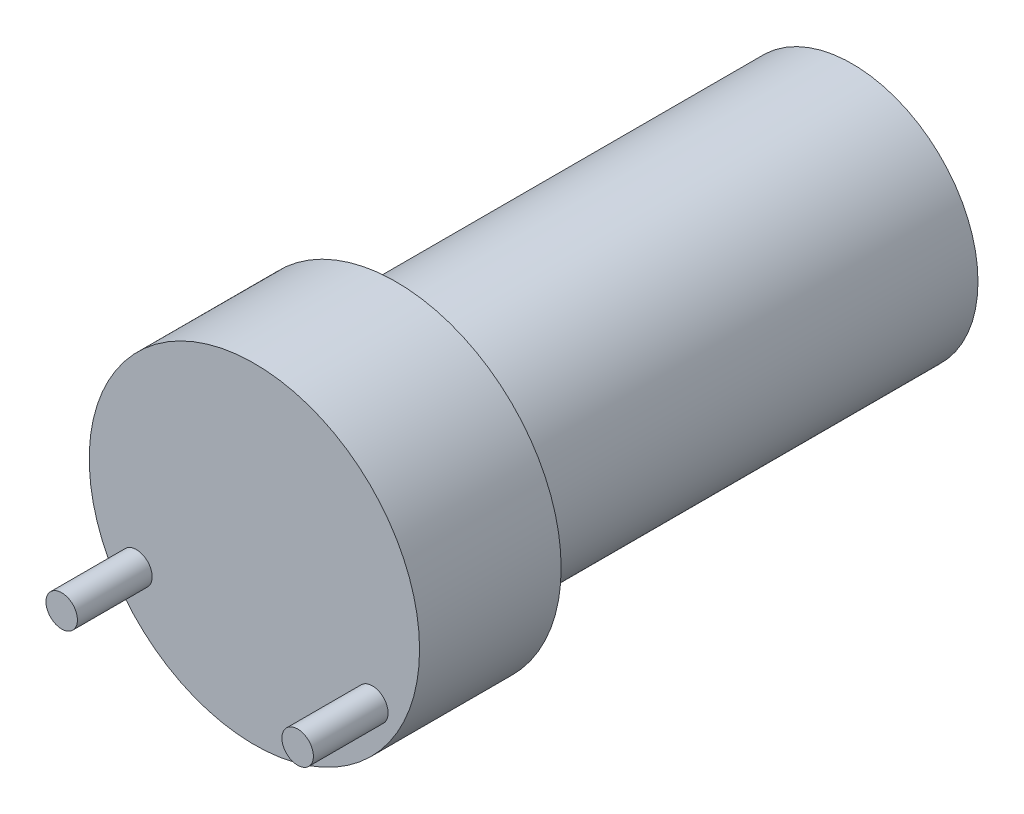
ISO-10303-21;
HEADER;
FILE_DESCRIPTION(('STEP AP214'),'2;1');
FILE_NAME('part.step','',(''),(''),'','','');
FILE_SCHEMA(('AUTOMOTIVE_DESIGN { 1 0 10303 214 1 1 1 1 }'));
ENDSEC;
DATA;
#1=APPLICATION_CONTEXT('core data for automotive mechanical design processes');
#2=APPLICATION_PROTOCOL_DEFINITION('international standard','automotive_design',2000,#1);
#3=PRODUCT_CONTEXT('',#1,'mechanical');
#4=PRODUCT('Part','Part','',(#3));
#5=PRODUCT_RELATED_PRODUCT_CATEGORY('part','',(#4));
#6=PRODUCT_DEFINITION_FORMATION('','',#4);
#7=PRODUCT_DEFINITION_CONTEXT('part definition',#1,'design');
#8=PRODUCT_DEFINITION('design','',#6,#7);
#9=PRODUCT_DEFINITION_SHAPE('','',#8);
#10=(LENGTH_UNIT() NAMED_UNIT(*) SI_UNIT(.MILLI.,.METRE.));
#11=(NAMED_UNIT(*) PLANE_ANGLE_UNIT() SI_UNIT($,.RADIAN.));
#12=(NAMED_UNIT(*) SI_UNIT($,.STERADIAN.) SOLID_ANGLE_UNIT());
#13=UNCERTAINTY_MEASURE_WITH_UNIT(LENGTH_MEASURE(1.E-05),#10,'distance_accuracy_value','');
#14=(GEOMETRIC_REPRESENTATION_CONTEXT(3) GLOBAL_UNCERTAINTY_ASSIGNED_CONTEXT((#13)) GLOBAL_UNIT_ASSIGNED_CONTEXT((#10,
#11,#12)) REPRESENTATION_CONTEXT('',''));
#15=CARTESIAN_POINT('',(0.,0.,0.));
#16=DIRECTION('',(0.,0.,1.));
#17=DIRECTION('',(1.,0.,0.));
#18=AXIS2_PLACEMENT_3D('',#15,#16,#17);
#19=CARTESIAN_POINT('',(0.,0.,18.));
#20=DIRECTION('',(0.,0.,-1.));
#21=DIRECTION('',(-1.,0.,0.));
#22=AXIS2_PLACEMENT_3D('',#19,#20,#21);
#23=CYLINDRICAL_SURFACE('',#22,21.);
#24=CARTESIAN_POINT('',(0.,0.,18.));
#25=DIRECTION('',(0.,0.,1.));
#26=DIRECTION('',(1.,0.,0.));
#27=AXIS2_PLACEMENT_3D('',#24,#25,#26);
#28=CIRCLE('',#27,21.);
#29=CARTESIAN_POINT('',(21.,0.,18.));
#30=VERTEX_POINT('',#29);
#31=EDGE_CURVE('E37',#30,#30,#28,.T.);
#32=ORIENTED_EDGE('',*,*,#31,.F.);
#33=EDGE_LOOP('',(#32));
#34=FACE_BOUND('',#33,.T.);
#35=CARTESIAN_POINT('',(0.,0.,0.));
#36=DIRECTION('',(0.,0.,1.));
#37=DIRECTION('',(1.,0.,0.));
#38=AXIS2_PLACEMENT_3D('',#35,#36,#37);
#39=CIRCLE('',#38,21.);
#40=CARTESIAN_POINT('',(21.,0.,0.));
#41=VERTEX_POINT('',#40);
#42=EDGE_CURVE('E41',#41,#41,#39,.T.);
#43=ORIENTED_EDGE('',*,*,#42,.T.);
#44=EDGE_LOOP('',(#43));
#45=FACE_BOUND('',#44,.T.);
#46=ADVANCED_FACE('F31',(#34,#45),#23,.T.);
#47=CARTESIAN_POINT('',(0.,0.,18.));
#48=DIRECTION('',(0.,0.,1.));
#49=DIRECTION('',(1.,0.,0.));
#50=AXIS2_PLACEMENT_3D('',#47,#48,#49);
#51=PLANE('',#50);
#52=CARTESIAN_POINT('',(15.,-8.99999999999999,18.));
#53=DIRECTION('',(0.,0.,1.));
#54=DIRECTION('',(1.,0.,0.));
#55=AXIS2_PLACEMENT_3D('',#52,#53,#54);
#56=CIRCLE('',#55,2.);
#57=CARTESIAN_POINT('',(17.,-8.99999999999999,18.));
#58=VERTEX_POINT('',#57);
#59=EDGE_CURVE('E57',#58,#58,#56,.T.);
#60=ORIENTED_EDGE('',*,*,#59,.F.);
#61=EDGE_LOOP('',(#60));
#62=FACE_BOUND('',#61,.T.);
#63=CARTESIAN_POINT('',(-15.,-9.,18.));
#64=DIRECTION('',(0.,0.,1.));
#65=DIRECTION('',(1.,0.,0.));
#66=AXIS2_PLACEMENT_3D('',#63,#64,#65);
#67=CIRCLE('',#66,2.);
#68=CARTESIAN_POINT('',(-13.,-9.,18.));
#69=VERTEX_POINT('',#68);
#70=EDGE_CURVE('E51',#69,#69,#67,.T.);
#71=ORIENTED_EDGE('',*,*,#70,.F.);
#72=EDGE_LOOP('',(#71));
#73=FACE_BOUND('',#72,.T.);
#74=ORIENTED_EDGE('',*,*,#31,.T.);
#75=EDGE_LOOP('',(#74));
#76=FACE_BOUND('',#75,.T.);
#77=ADVANCED_FACE('F72',(#62,#73,#76),#51,.T.);
#78=CARTESIAN_POINT('',(0.,0.,0.));
#79=DIRECTION('',(0.,0.,1.));
#80=DIRECTION('',(1.,0.,0.));
#81=AXIS2_PLACEMENT_3D('',#78,#79,#80);
#82=PLANE('',#81);
#83=CARTESIAN_POINT('',(0.,0.,0.));
#84=DIRECTION('',(0.,0.,1.));
#85=DIRECTION('',(1.,0.,0.));
#86=AXIS2_PLACEMENT_3D('',#83,#84,#85);
#87=CIRCLE('',#86,16.);
#88=CARTESIAN_POINT('',(16.,0.,0.));
#89=VERTEX_POINT('',#88);
#90=EDGE_CURVE('E10',#89,#89,#87,.F.);
#91=ORIENTED_EDGE('',*,*,#90,.F.);
#92=EDGE_LOOP('',(#91));
#93=FACE_BOUND('',#92,.T.);
#94=ORIENTED_EDGE('',*,*,#42,.F.);
#95=EDGE_LOOP('',(#94));
#96=FACE_BOUND('',#95,.T.);
#97=ADVANCED_FACE('F75',(#93,#96),#82,.F.);
#98=CARTESIAN_POINT('',(0.,0.,-58.));
#99=DIRECTION('',(0.,0.,1.));
#100=DIRECTION('',(1.,0.,0.));
#101=AXIS2_PLACEMENT_3D('',#98,#99,#100);
#102=CYLINDRICAL_SURFACE('',#101,16.);
#103=CARTESIAN_POINT('',(0.,0.,-58.));
#104=DIRECTION('',(0.,0.,-1.));
#105=DIRECTION('',(-1.,0.,0.));
#106=AXIS2_PLACEMENT_3D('',#103,#104,#105);
#107=CIRCLE('',#106,16.);
#108=CARTESIAN_POINT('',(16.,0.,-58.));
#109=VERTEX_POINT('',#108);
#110=EDGE_CURVE('E46',#109,#109,#107,.T.);
#111=CARTESIAN_POINT('',(16.,0.,-58.));
#112=CARTESIAN_POINT('',(16.,0.,-57.3958333333333));
#113=CARTESIAN_POINT('',(16.,0.,-56.7916666666667));
#114=CARTESIAN_POINT('',(16.,0.,-55.5833333333333));
#115=CARTESIAN_POINT('',(16.,0.,-54.9791666666667));
#116=CARTESIAN_POINT('',(16.,0.,-53.7708333333333));
#117=CARTESIAN_POINT('',(16.,0.,-53.1666666666667));
#118=CARTESIAN_POINT('',(16.,0.,-51.9583333333333));
#119=CARTESIAN_POINT('',(16.,0.,-51.3541666666667));
#120=CARTESIAN_POINT('',(16.,0.,-50.1458333333333));
#121=CARTESIAN_POINT('',(16.,0.,-49.5416666666667));
#122=CARTESIAN_POINT('',(16.,0.,-48.3333333333333));
#123=CARTESIAN_POINT('',(16.,0.,-47.7291666666667));
#124=CARTESIAN_POINT('',(16.,0.,-46.5208333333333));
#125=CARTESIAN_POINT('',(16.,0.,-45.9166666666667));
#126=CARTESIAN_POINT('',(16.,0.,-44.7083333333333));
#127=CARTESIAN_POINT('',(16.,0.,-44.1041666666667));
#128=CARTESIAN_POINT('',(16.,0.,-42.8958333333333));
#129=CARTESIAN_POINT('',(16.,0.,-42.2916666666667));
#130=CARTESIAN_POINT('',(16.,0.,-41.0833333333333));
#131=CARTESIAN_POINT('',(16.,0.,-40.4791666666667));
#132=CARTESIAN_POINT('',(16.,0.,-39.2708333333333));
#133=CARTESIAN_POINT('',(16.,0.,-38.6666666666667));
#134=CARTESIAN_POINT('',(16.,0.,-37.4583333333333));
#135=CARTESIAN_POINT('',(16.,0.,-36.8541666666667));
#136=CARTESIAN_POINT('',(16.,0.,-35.6458333333333));
#137=CARTESIAN_POINT('',(16.,0.,-35.0416666666667));
#138=CARTESIAN_POINT('',(16.,0.,-33.8333333333333));
#139=CARTESIAN_POINT('',(16.,0.,-33.2291666666667));
#140=CARTESIAN_POINT('',(16.,0.,-32.0208333333333));
#141=CARTESIAN_POINT('',(16.,0.,-31.4166666666667));
#142=CARTESIAN_POINT('',(16.,0.,-30.2083333333333));
#143=CARTESIAN_POINT('',(16.,0.,-29.6041666666667));
#144=CARTESIAN_POINT('',(16.,0.,-28.3958333333333));
#145=CARTESIAN_POINT('',(16.,0.,-27.7916666666667));
#146=CARTESIAN_POINT('',(16.,0.,-26.5833333333333));
#147=CARTESIAN_POINT('',(16.,0.,-25.9791666666667));
#148=CARTESIAN_POINT('',(16.,0.,-24.7708333333333));
#149=CARTESIAN_POINT('',(16.,0.,-24.1666666666667));
#150=CARTESIAN_POINT('',(16.,0.,-22.9583333333333));
#151=CARTESIAN_POINT('',(16.,0.,-22.3541666666667));
#152=CARTESIAN_POINT('',(16.,0.,-21.1458333333333));
#153=CARTESIAN_POINT('',(16.,0.,-20.5416666666667));
#154=CARTESIAN_POINT('',(16.,0.,-19.3333333333333));
#155=CARTESIAN_POINT('',(16.,0.,-18.7291666666667));
#156=CARTESIAN_POINT('',(16.,0.,-17.5208333333333));
#157=CARTESIAN_POINT('',(16.,0.,-16.9166666666667));
#158=CARTESIAN_POINT('',(16.,0.,-15.7083333333333));
#159=CARTESIAN_POINT('',(16.,0.,-15.1041666666667));
#160=CARTESIAN_POINT('',(16.,0.,-13.8958333333333));
#161=CARTESIAN_POINT('',(16.,0.,-13.2916666666667));
#162=CARTESIAN_POINT('',(16.,0.,-12.0833333333333));
#163=CARTESIAN_POINT('',(16.,0.,-11.4791666666667));
#164=CARTESIAN_POINT('',(16.,0.,-10.2708333333333));
#165=CARTESIAN_POINT('',(16.,0.,-9.66666666666667));
#166=CARTESIAN_POINT('',(16.,0.,-8.45833333333333));
#167=CARTESIAN_POINT('',(16.,0.,-7.85416666666667));
#168=CARTESIAN_POINT('',(16.,0.,-6.64583333333333));
#169=CARTESIAN_POINT('',(16.,0.,-6.04166666666667));
#170=CARTESIAN_POINT('',(16.,0.,-4.83333333333333));
#171=CARTESIAN_POINT('',(16.,0.,-4.22916666666667));
#172=CARTESIAN_POINT('',(16.,0.,-3.02083333333334));
#173=CARTESIAN_POINT('',(16.,0.,-2.41666666666667));
#174=CARTESIAN_POINT('',(16.,0.,-1.20833333333333));
#175=CARTESIAN_POINT('',(16.,0.,-0.604166666666666));
#176=CARTESIAN_POINT('',(16.,0.,0.));
#177=B_SPLINE_CURVE_WITH_KNOTS('',3,(#111,#112,#113,#114,#115,#116,#117,#118,#119,#120,#121,
#122,#123,#124,#125,#126,#127,#128,#129,#130,#131,#132,#133,#134,#135,#136,#137,#138,#139,#140,
#141,#142,#143,#144,#145,#146,#147,#148,#149,#150,#151,#152,#153,#154,#155,#156,#157,#158,#159,
#160,#161,#162,#163,#164,#165,#166,#167,#168,#169,#170,#171,#172,#173,#174,#175,#176),
.UNSPECIFIED.,.F.,.F.,(4,2,2,2,2,2,2,2,2,2,2,2,2,2,2,2,2,2,2,2,2,2,2,2,2,2,2,2,2,2,2,2,4),(0.,
1.8125,3.625,5.4375,7.25000000000001,9.0625,10.875,12.6875,14.5,16.3125,18.125,19.9375,21.75,
23.5625,25.375,27.1875,29.,30.8125,32.625,34.4375,36.25,38.0625,39.875,41.6875,43.5,45.3125,
47.125,48.9375,50.75,52.5625,54.375,56.1875,58.),.UNSPECIFIED.);
#178=EDGE_CURVE('BSEAM90',#109,#89,#177,.T.);
#179=ORIENTED_EDGE('',*,*,#110,.F.);
#180=ORIENTED_EDGE('',*,*,#90,.T.);
#181=ORIENTED_EDGE('',*,*,#178,.T.);
#182=ORIENTED_EDGE('',*,*,#178,.F.);
#183=EDGE_LOOP('',(#179,#181,#180,#182));
#184=FACE_BOUND('',#183,.T.);
#185=ADVANCED_FACE('F90',(#184),#102,.T.);
#186=CARTESIAN_POINT('',(0.,0.,-58.));
#187=DIRECTION('',(0.,0.,-1.));
#188=DIRECTION('',(-1.,0.,0.));
#189=AXIS2_PLACEMENT_3D('',#186,#187,#188);
#190=PLANE('',#189);
#191=ORIENTED_EDGE('',*,*,#110,.T.);
#192=EDGE_LOOP('',(#191));
#193=FACE_BOUND('',#192,.T.);
#194=ADVANCED_FACE('F81',(#193),#190,.T.);
#195=CARTESIAN_POINT('',(-15.,-9.,27.5));
#196=DIRECTION('',(0.,0.,-1.));
#197=DIRECTION('',(-1.,0.,0.));
#198=AXIS2_PLACEMENT_3D('',#195,#196,#197);
#199=CYLINDRICAL_SURFACE('',#198,2.);
#200=CARTESIAN_POINT('',(-15.,-9.,27.5));
#201=DIRECTION('',(0.,0.,1.));
#202=DIRECTION('',(1.,0.,0.));
#203=AXIS2_PLACEMENT_3D('',#200,#201,#202);
#204=CIRCLE('',#203,2.);
#205=CARTESIAN_POINT('',(-13.,-9.,27.5));
#206=VERTEX_POINT('',#205);
#207=EDGE_CURVE('E50',#206,#206,#204,.T.);
#208=ORIENTED_EDGE('',*,*,#207,.F.);
#209=EDGE_LOOP('',(#208));
#210=FACE_BOUND('',#209,.T.);
#211=ORIENTED_EDGE('',*,*,#70,.T.);
#212=EDGE_LOOP('',(#211));
#213=FACE_BOUND('',#212,.T.);
#214=ADVANCED_FACE('F79',(#210,#213),#199,.T.);
#215=CARTESIAN_POINT('',(-15.,-9.,27.5));
#216=DIRECTION('',(0.,0.,1.));
#217=DIRECTION('',(1.,0.,0.));
#218=AXIS2_PLACEMENT_3D('',#215,#216,#217);
#219=PLANE('',#218);
#220=ORIENTED_EDGE('',*,*,#207,.T.);
#221=EDGE_LOOP('',(#220));
#222=FACE_BOUND('',#221,.T.);
#223=ADVANCED_FACE('F68',(#222),#219,.T.);
#224=CARTESIAN_POINT('',(15.,-8.99999999999999,27.5));
#225=DIRECTION('',(0.,0.,-1.));
#226=DIRECTION('',(-1.,0.,0.));
#227=AXIS2_PLACEMENT_3D('',#224,#225,#226);
#228=CYLINDRICAL_SURFACE('',#227,2.);
#229=CARTESIAN_POINT('',(15.,-8.99999999999999,27.5));
#230=DIRECTION('',(0.,0.,1.));
#231=DIRECTION('',(1.,0.,0.));
#232=AXIS2_PLACEMENT_3D('',#229,#230,#231);
#233=CIRCLE('',#232,2.);
#234=CARTESIAN_POINT('',(17.,-8.99999999999999,27.5));
#235=VERTEX_POINT('',#234);
#236=EDGE_CURVE('E54',#235,#235,#233,.T.);
#237=ORIENTED_EDGE('',*,*,#236,.F.);
#238=EDGE_LOOP('',(#237));
#239=FACE_BOUND('',#238,.T.);
#240=ORIENTED_EDGE('',*,*,#59,.T.);
#241=EDGE_LOOP('',(#240));
#242=FACE_BOUND('',#241,.T.);
#243=ADVANCED_FACE('F65',(#239,#242),#228,.T.);
#244=CARTESIAN_POINT('',(15.,-8.99999999999999,27.5));
#245=DIRECTION('',(0.,0.,1.));
#246=DIRECTION('',(1.,0.,0.));
#247=AXIS2_PLACEMENT_3D('',#244,#245,#246);
#248=PLANE('',#247);
#249=ORIENTED_EDGE('',*,*,#236,.T.);
#250=EDGE_LOOP('',(#249));
#251=FACE_BOUND('',#250,.T.);
#252=ADVANCED_FACE('F63',(#251),#248,.T.);
#253=CLOSED_SHELL('',(#46,#77,#97,#185,#194,#214,#223,#243,#252));
#254=MANIFOLD_SOLID_BREP('B2',#253);
#255=ADVANCED_BREP_SHAPE_REPRESENTATION('',(#18,#254),#14);
#256=SHAPE_DEFINITION_REPRESENTATION(#9,#255);
ENDSEC;
END-ISO-10303-21;
